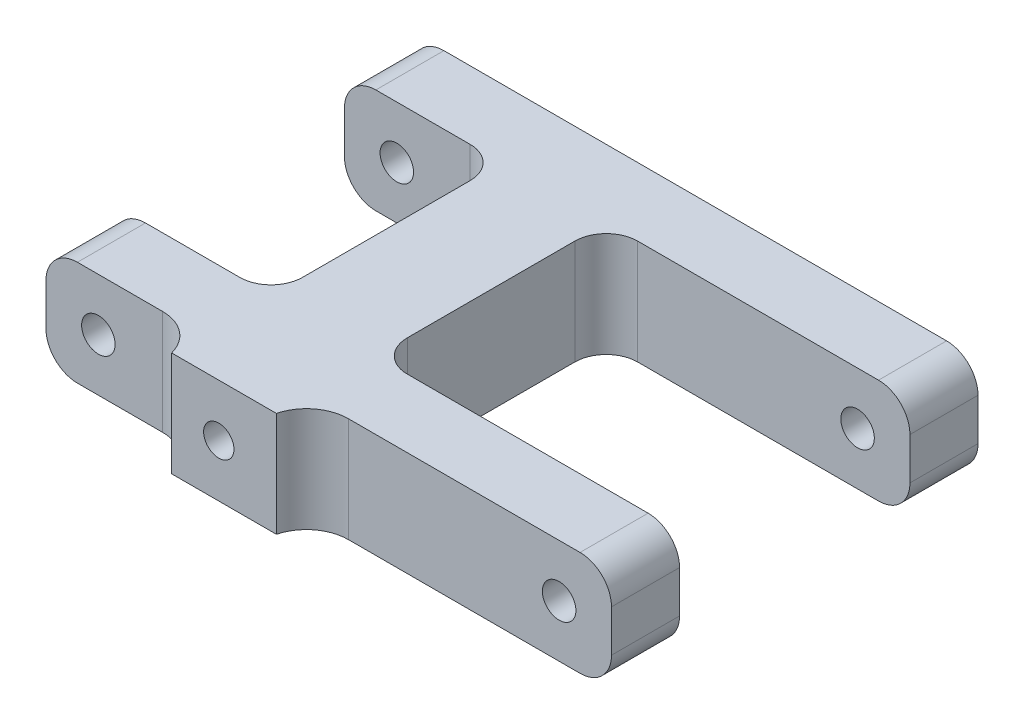
ISO-10303-21;
HEADER;
FILE_DESCRIPTION(('STEP AP214'),'2;1');
FILE_NAME('part.step','',(''),(''),'','','');
FILE_SCHEMA(('AUTOMOTIVE_DESIGN { 1 0 10303 214 1 1 1 1 }'));
ENDSEC;
DATA;
#1=APPLICATION_CONTEXT('core data for automotive mechanical design processes');
#2=APPLICATION_PROTOCOL_DEFINITION('international standard','automotive_design',2000,#1);
#3=PRODUCT_CONTEXT('',#1,'mechanical');
#4=PRODUCT('Part','Part','',(#3));
#5=PRODUCT_RELATED_PRODUCT_CATEGORY('part','',(#4));
#6=PRODUCT_DEFINITION_FORMATION('','',#4);
#7=PRODUCT_DEFINITION_CONTEXT('part definition',#1,'design');
#8=PRODUCT_DEFINITION('design','',#6,#7);
#9=PRODUCT_DEFINITION_SHAPE('','',#8);
#10=(LENGTH_UNIT() NAMED_UNIT(*) SI_UNIT(.MILLI.,.METRE.));
#11=(NAMED_UNIT(*) PLANE_ANGLE_UNIT() SI_UNIT($,.RADIAN.));
#12=(NAMED_UNIT(*) SI_UNIT($,.STERADIAN.) SOLID_ANGLE_UNIT());
#13=UNCERTAINTY_MEASURE_WITH_UNIT(LENGTH_MEASURE(1.E-05),#10,'distance_accuracy_value','');
#14=(GEOMETRIC_REPRESENTATION_CONTEXT(3) GLOBAL_UNCERTAINTY_ASSIGNED_CONTEXT((#13)) GLOBAL_UNIT_ASSIGNED_CONTEXT((#10,
#11,#12)) REPRESENTATION_CONTEXT('',''));
#15=CARTESIAN_POINT('',(0.,0.,0.));
#16=DIRECTION('',(0.,0.,1.));
#17=DIRECTION('',(1.,0.,0.));
#18=AXIS2_PLACEMENT_3D('',#15,#16,#17);
#19=CARTESIAN_POINT('',(0.,10.,35.));
#20=DIRECTION('',(0.,0.,-1.));
#21=DIRECTION('',(-1.,0.,0.));
#22=AXIS2_PLACEMENT_3D('',#19,#20,#21);
#23=PLANE('',#22);
#24=CARTESIAN_POINT('',(5.,5.,35.));
#25=DIRECTION('',(0.,0.,1.));
#26=DIRECTION('',(1.,0.,0.));
#27=AXIS2_PLACEMENT_3D('',#24,#25,#26);
#28=CIRCLE('',#27,1.6);
#29=CARTESIAN_POINT('',(6.6,5.,35.));
#30=VERTEX_POINT('',#29);
#31=EDGE_CURVE('E254',#30,#30,#28,.T.);
#32=ORIENTED_EDGE('',*,*,#31,.F.);
#33=EDGE_LOOP('',(#32));
#34=FACE_BOUND('',#33,.T.);
#35=DIRECTION('',(1.,0.,0.));
#36=VECTOR('',#35,1.);
#37=CARTESIAN_POINT('',(0.,0.,35.));
#38=LINE('',#37,#36);
#39=CARTESIAN_POINT('',(3.,0.,35.));
#40=VERTEX_POINT('',#39);
#41=CARTESIAN_POINT('',(11.1270166537926,0.,35.));
#42=VERTEX_POINT('',#41);
#43=EDGE_CURVE('E312',#40,#42,#38,.T.);
#44=ORIENTED_EDGE('',*,*,#43,.T.);
#45=DIRECTION('',(0.,-1.,0.));
#46=VECTOR('',#45,1.);
#47=CARTESIAN_POINT('',(11.1270166537926,10.,35.));
#48=LINE('',#47,#46);
#49=CARTESIAN_POINT('',(11.1270166537926,10.,35.));
#50=VERTEX_POINT('',#49);
#51=EDGE_CURVE('E54',#42,#50,#48,.F.);
#52=ORIENTED_EDGE('',*,*,#51,.T.);
#53=DIRECTION('',(1.,0.,0.));
#54=VECTOR('',#53,1.);
#55=CARTESIAN_POINT('',(0.,10.,35.));
#56=LINE('',#55,#54);
#57=CARTESIAN_POINT('',(3.,10.,35.));
#58=VERTEX_POINT('',#57);
#59=EDGE_CURVE('E305',#58,#50,#56,.T.);
#60=ORIENTED_EDGE('',*,*,#59,.F.);
#61=CARTESIAN_POINT('',(3.,7.,35.));
#62=DIRECTION('',(0.,0.,-1.));
#63=DIRECTION('',(-1.,0.,0.));
#64=AXIS2_PLACEMENT_3D('',#61,#62,#63);
#65=CIRCLE('',#64,3.);
#66=CARTESIAN_POINT('',(0.,7.,35.));
#67=VERTEX_POINT('',#66);
#68=EDGE_CURVE('E342',#58,#67,#65,.F.);
#69=ORIENTED_EDGE('',*,*,#68,.T.);
#70=DIRECTION('',(0.,-1.,0.));
#71=VECTOR('',#70,1.);
#72=CARTESIAN_POINT('',(0.,10.,35.));
#73=LINE('',#72,#71);
#74=CARTESIAN_POINT('',(0.,3.,35.));
#75=VERTEX_POINT('',#74);
#76=EDGE_CURVE('E325',#67,#75,#73,.T.);
#77=ORIENTED_EDGE('',*,*,#76,.T.);
#78=CARTESIAN_POINT('',(3.,3.,35.));
#79=DIRECTION('',(0.,0.,-1.));
#80=DIRECTION('',(-1.,0.,0.));
#81=AXIS2_PLACEMENT_3D('',#78,#79,#80);
#82=CIRCLE('',#81,3.);
#83=EDGE_CURVE('E344',#75,#40,#82,.F.);
#84=ORIENTED_EDGE('',*,*,#83,.T.);
#85=EDGE_LOOP('',(#44,#52,#60,#69,#77,#84));
#86=FACE_BOUND('',#85,.T.);
#87=ADVANCED_FACE('F33',(#34,#86),#23,.F.);
#88=CARTESIAN_POINT('',(49.,5.,35.));
#89=DIRECTION('',(0.,0.,1.));
#90=DIRECTION('',(1.,0.,0.));
#91=AXIS2_PLACEMENT_3D('',#88,#89,#90);
#92=CIRCLE('',#91,1.59999999999999);
#93=CARTESIAN_POINT('',(50.6,5.,35.));
#94=VERTEX_POINT('',#93);
#95=EDGE_CURVE('E244',#94,#94,#92,.T.);
#96=ORIENTED_EDGE('',*,*,#95,.F.);
#97=EDGE_LOOP('',(#96));
#98=FACE_BOUND('',#97,.T.);
#99=CARTESIAN_POINT('',(28.8729833462074,10.,35.));
#100=VERTEX_POINT('',#99);
#101=CARTESIAN_POINT('',(51.,10.,35.));
#102=VERTEX_POINT('',#101);
#103=EDGE_CURVE('E308',#100,#102,#56,.T.);
#104=ORIENTED_EDGE('',*,*,#103,.F.);
#105=DIRECTION('',(0.,1.,0.));
#106=VECTOR('',#105,1.);
#107=CARTESIAN_POINT('',(28.8729833462074,9.99999999999999,35.));
#108=LINE('',#107,#106);
#109=CARTESIAN_POINT('',(28.8729833462074,0.,35.));
#110=VERTEX_POINT('',#109);
#111=EDGE_CURVE('E447',#100,#110,#108,.F.);
#112=ORIENTED_EDGE('',*,*,#111,.T.);
#113=CARTESIAN_POINT('',(51.,0.,35.));
#114=VERTEX_POINT('',#113);
#115=EDGE_CURVE('E299',#110,#114,#38,.T.);
#116=ORIENTED_EDGE('',*,*,#115,.T.);
#117=CARTESIAN_POINT('',(51.,3.,35.));
#118=DIRECTION('',(0.,0.,-1.));
#119=DIRECTION('',(-1.,0.,0.));
#120=AXIS2_PLACEMENT_3D('',#117,#118,#119);
#121=CIRCLE('',#120,3.);
#122=CARTESIAN_POINT('',(54.,3.,35.));
#123=VERTEX_POINT('',#122);
#124=EDGE_CURVE('E340',#114,#123,#121,.F.);
#125=ORIENTED_EDGE('',*,*,#124,.T.);
#126=DIRECTION('',(0.,-1.,0.));
#127=VECTOR('',#126,1.);
#128=CARTESIAN_POINT('',(54.,10.,35.));
#129=LINE('',#128,#127);
#130=CARTESIAN_POINT('',(54.,7.,35.));
#131=VERTEX_POINT('',#130);
#132=EDGE_CURVE('E322',#131,#123,#129,.T.);
#133=ORIENTED_EDGE('',*,*,#132,.F.);
#134=CARTESIAN_POINT('',(51.,7.,35.));
#135=DIRECTION('',(0.,0.,-1.));
#136=DIRECTION('',(-1.,0.,0.));
#137=AXIS2_PLACEMENT_3D('',#134,#135,#136);
#138=CIRCLE('',#137,3.);
#139=EDGE_CURVE('E337',#131,#102,#138,.F.);
#140=ORIENTED_EDGE('',*,*,#139,.T.);
#141=EDGE_LOOP('',(#104,#112,#116,#125,#133,#140));
#142=FACE_BOUND('',#141,.T.);
#143=ADVANCED_FACE('F460',(#98,#142),#23,.F.);
#144=CARTESIAN_POINT('',(0.,10.,0.));
#145=DIRECTION('',(1.,0.,0.));
#146=DIRECTION('',(0.,0.,-1.));
#147=AXIS2_PLACEMENT_3D('',#144,#145,#146);
#148=PLANE('',#147);
#149=DIRECTION('',(0.,-1.,0.));
#150=VECTOR('',#149,1.);
#151=CARTESIAN_POINT('',(0.,10.,0.));
#152=LINE('',#151,#150);
#153=CARTESIAN_POINT('',(0.,7.,0.));
#154=VERTEX_POINT('',#153);
#155=CARTESIAN_POINT('',(0.,3.,0.));
#156=VERTEX_POINT('',#155);
#157=EDGE_CURVE('E311',#154,#156,#152,.T.);
#158=ORIENTED_EDGE('',*,*,#157,.T.);
#159=DIRECTION('',(0.,0.,1.));
#160=VECTOR('',#159,1.);
#161=CARTESIAN_POINT('',(0.,3.,0.));
#162=LINE('',#161,#160);
#163=CARTESIAN_POINT('',(0.,3.,6.5));
#164=VERTEX_POINT('',#163);
#165=EDGE_CURVE('E376',#156,#164,#162,.T.);
#166=ORIENTED_EDGE('',*,*,#165,.T.);
#167=DIRECTION('',(0.,-1.,0.));
#168=VECTOR('',#167,1.);
#169=CARTESIAN_POINT('',(0.,10.,6.5));
#170=LINE('',#169,#168);
#171=CARTESIAN_POINT('',(0.,7.,6.5));
#172=VERTEX_POINT('',#171);
#173=EDGE_CURVE('E264',#172,#164,#170,.T.);
#174=ORIENTED_EDGE('',*,*,#173,.F.);
#175=DIRECTION('',(0.,0.,1.));
#176=VECTOR('',#175,1.);
#177=CARTESIAN_POINT('',(0.,7.,0.));
#178=LINE('',#177,#176);
#179=EDGE_CURVE('E374',#172,#154,#178,.F.);
#180=ORIENTED_EDGE('',*,*,#179,.T.);
#181=EDGE_LOOP('',(#158,#166,#174,#180));
#182=FACE_BOUND('',#181,.T.);
#183=ADVANCED_FACE('F481',(#182),#148,.F.);
#184=CARTESIAN_POINT('',(54.,10.,0.));
#185=DIRECTION('',(-1.,0.,0.));
#186=DIRECTION('',(0.,0.,1.));
#187=AXIS2_PLACEMENT_3D('',#184,#185,#186);
#188=PLANE('',#187);
#189=ORIENTED_EDGE('',*,*,#132,.T.);
#190=DIRECTION('',(0.,0.,-1.));
#191=VECTOR('',#190,1.);
#192=CARTESIAN_POINT('',(54.,3.,0.));
#193=LINE('',#192,#191);
#194=CARTESIAN_POINT('',(54.,3.,28.5));
#195=VERTEX_POINT('',#194);
#196=EDGE_CURVE('E404',#123,#195,#193,.T.);
#197=ORIENTED_EDGE('',*,*,#196,.T.);
#198=DIRECTION('',(0.,-1.,0.));
#199=VECTOR('',#198,1.);
#200=CARTESIAN_POINT('',(54.,10.,28.5));
#201=LINE('',#200,#199);
#202=CARTESIAN_POINT('',(54.,7.,28.5));
#203=VERTEX_POINT('',#202);
#204=EDGE_CURVE('E279',#203,#195,#201,.T.);
#205=ORIENTED_EDGE('',*,*,#204,.F.);
#206=DIRECTION('',(0.,0.,-1.));
#207=VECTOR('',#206,1.);
#208=CARTESIAN_POINT('',(54.,7.,35.));
#209=LINE('',#208,#207);
#210=EDGE_CURVE('E402',#203,#131,#209,.F.);
#211=ORIENTED_EDGE('',*,*,#210,.T.);
#212=EDGE_LOOP('',(#189,#197,#205,#211));
#213=FACE_BOUND('',#212,.T.);
#214=ADVANCED_FACE('F491',(#213),#188,.F.);
#215=DIRECTION('',(0.,1.,0.));
#216=VECTOR('',#215,1.);
#217=CARTESIAN_POINT('',(0.,10.,28.5));
#218=LINE('',#217,#216);
#219=CARTESIAN_POINT('',(0.,3.,28.5));
#220=VERTEX_POINT('',#219);
#221=CARTESIAN_POINT('',(0.,7.,28.5));
#222=VERTEX_POINT('',#221);
#223=EDGE_CURVE('E269',#220,#222,#218,.T.);
#224=ORIENTED_EDGE('',*,*,#223,.F.);
#225=DIRECTION('',(0.,0.,1.));
#226=VECTOR('',#225,1.);
#227=CARTESIAN_POINT('',(0.,3.,0.));
#228=LINE('',#227,#226);
#229=EDGE_CURVE('E334',#220,#75,#228,.T.);
#230=ORIENTED_EDGE('',*,*,#229,.T.);
#231=ORIENTED_EDGE('',*,*,#76,.F.);
#232=DIRECTION('',(0.,0.,1.));
#233=VECTOR('',#232,1.);
#234=CARTESIAN_POINT('',(0.,7.,28.5));
#235=LINE('',#234,#233);
#236=EDGE_CURVE('E328',#67,#222,#235,.F.);
#237=ORIENTED_EDGE('',*,*,#236,.T.);
#238=EDGE_LOOP('',(#224,#230,#231,#237));
#239=FACE_BOUND('',#238,.T.);
#240=ADVANCED_FACE('F488',(#239),#148,.F.);
#241=DIRECTION('',(0.,-1.,0.));
#242=VECTOR('',#241,1.);
#243=CARTESIAN_POINT('',(54.,10.,0.));
#244=LINE('',#243,#242);
#245=CARTESIAN_POINT('',(54.,7.,0.));
#246=VERTEX_POINT('',#245);
#247=CARTESIAN_POINT('',(54.,3.,0.));
#248=VERTEX_POINT('',#247);
#249=EDGE_CURVE('E319',#246,#248,#244,.T.);
#250=ORIENTED_EDGE('',*,*,#249,.F.);
#251=DIRECTION('',(0.,0.,-1.));
#252=VECTOR('',#251,1.);
#253=CARTESIAN_POINT('',(54.,7.,6.5));
#254=LINE('',#253,#252);
#255=CARTESIAN_POINT('',(54.,7.,6.5));
#256=VERTEX_POINT('',#255);
#257=EDGE_CURVE('E395',#246,#256,#254,.F.);
#258=ORIENTED_EDGE('',*,*,#257,.T.);
#259=DIRECTION('',(0.,1.,0.));
#260=VECTOR('',#259,1.);
#261=CARTESIAN_POINT('',(54.,10.,6.5));
#262=LINE('',#261,#260);
#263=CARTESIAN_POINT('',(54.,3.,6.5));
#264=VERTEX_POINT('',#263);
#265=EDGE_CURVE('E289',#264,#256,#262,.T.);
#266=ORIENTED_EDGE('',*,*,#265,.F.);
#267=DIRECTION('',(0.,0.,-1.));
#268=VECTOR('',#267,1.);
#269=CARTESIAN_POINT('',(54.,3.,0.));
#270=LINE('',#269,#268);
#271=EDGE_CURVE('E392',#264,#248,#270,.T.);
#272=ORIENTED_EDGE('',*,*,#271,.T.);
#273=EDGE_LOOP('',(#250,#258,#266,#272));
#274=FACE_BOUND('',#273,.T.);
#275=ADVANCED_FACE('F486',(#274),#188,.F.);
#276=CARTESIAN_POINT('',(0.,10.,0.));
#277=DIRECTION('',(0.,0.,1.));
#278=DIRECTION('',(1.,0.,0.));
#279=AXIS2_PLACEMENT_3D('',#276,#277,#278);
#280=PLANE('',#279);
#281=CARTESIAN_POINT('',(49.,5.,0.));
#282=DIRECTION('',(0.,0.,1.));
#283=DIRECTION('',(1.,0.,0.));
#284=AXIS2_PLACEMENT_3D('',#281,#282,#283);
#285=CIRCLE('',#284,1.59999999999999);
#286=CARTESIAN_POINT('',(50.6,5.,0.));
#287=VERTEX_POINT('',#286);
#288=EDGE_CURVE('E245',#287,#287,#285,.T.);
#289=ORIENTED_EDGE('',*,*,#288,.T.);
#290=EDGE_LOOP('',(#289));
#291=FACE_BOUND('',#290,.T.);
#292=CARTESIAN_POINT('',(5.,5.,0.));
#293=DIRECTION('',(0.,0.,1.));
#294=DIRECTION('',(1.,0.,0.));
#295=AXIS2_PLACEMENT_3D('',#292,#293,#294);
#296=CIRCLE('',#295,1.6);
#297=CARTESIAN_POINT('',(6.6,5.,0.));
#298=VERTEX_POINT('',#297);
#299=EDGE_CURVE('E255',#298,#298,#296,.T.);
#300=ORIENTED_EDGE('',*,*,#299,.T.);
#301=EDGE_LOOP('',(#300));
#302=FACE_BOUND('',#301,.T.);
#303=DIRECTION('',(-1.,0.,0.));
#304=VECTOR('',#303,1.);
#305=CARTESIAN_POINT('',(0.,0.,0.));
#306=LINE('',#305,#304);
#307=CARTESIAN_POINT('',(51.,0.,0.));
#308=VERTEX_POINT('',#307);
#309=CARTESIAN_POINT('',(3.,0.,0.));
#310=VERTEX_POINT('',#309);
#311=EDGE_CURVE('E314',#308,#310,#306,.T.);
#312=ORIENTED_EDGE('',*,*,#311,.T.);
#313=CARTESIAN_POINT('',(3.,3.,0.));
#314=DIRECTION('',(0.,0.,1.));
#315=DIRECTION('',(1.,0.,0.));
#316=AXIS2_PLACEMENT_3D('',#313,#314,#315);
#317=CIRCLE('',#316,3.);
#318=EDGE_CURVE('E390',#310,#156,#317,.F.);
#319=ORIENTED_EDGE('',*,*,#318,.T.);
#320=ORIENTED_EDGE('',*,*,#157,.F.);
#321=CARTESIAN_POINT('',(3.,7.,0.));
#322=DIRECTION('',(0.,0.,1.));
#323=DIRECTION('',(1.,0.,0.));
#324=AXIS2_PLACEMENT_3D('',#321,#322,#323);
#325=CIRCLE('',#324,3.);
#326=CARTESIAN_POINT('',(3.,10.,0.));
#327=VERTEX_POINT('',#326);
#328=EDGE_CURVE('E388',#154,#327,#325,.F.);
#329=ORIENTED_EDGE('',*,*,#328,.T.);
#330=DIRECTION('',(-1.,0.,0.));
#331=VECTOR('',#330,1.);
#332=CARTESIAN_POINT('',(0.,10.,0.));
#333=LINE('',#332,#331);
#334=CARTESIAN_POINT('',(51.,10.,0.));
#335=VERTEX_POINT('',#334);
#336=EDGE_CURVE('E307',#335,#327,#333,.T.);
#337=ORIENTED_EDGE('',*,*,#336,.F.);
#338=CARTESIAN_POINT('',(51.,7.,0.));
#339=DIRECTION('',(0.,0.,1.));
#340=DIRECTION('',(1.,0.,0.));
#341=AXIS2_PLACEMENT_3D('',#338,#339,#340);
#342=CIRCLE('',#341,3.);
#343=EDGE_CURVE('E386',#335,#246,#342,.F.);
#344=ORIENTED_EDGE('',*,*,#343,.T.);
#345=ORIENTED_EDGE('',*,*,#249,.T.);
#346=CARTESIAN_POINT('',(51.,3.,0.));
#347=DIRECTION('',(0.,0.,1.));
#348=DIRECTION('',(1.,0.,0.));
#349=AXIS2_PLACEMENT_3D('',#346,#347,#348);
#350=CIRCLE('',#349,3.);
#351=EDGE_CURVE('E384',#248,#308,#350,.F.);
#352=ORIENTED_EDGE('',*,*,#351,.T.);
#353=EDGE_LOOP('',(#312,#319,#320,#329,#337,#344,#345,#352));
#354=FACE_BOUND('',#353,.T.);
#355=ADVANCED_FACE('F577',(#291,#302,#354),#280,.F.);
#356=CARTESIAN_POINT('',(0.,10.,0.));
#357=DIRECTION('',(0.,1.,0.));
#358=DIRECTION('',(0.,0.,1.));
#359=AXIS2_PLACEMENT_3D('',#356,#357,#358);
#360=PLANE('',#359);
#361=DIRECTION('',(0.,0.,-1.));
#362=VECTOR('',#361,1.);
#363=CARTESIAN_POINT('',(15.,10.,6.5));
#364=LINE('',#363,#362);
#365=CARTESIAN_POINT('',(15.,10.,25.5));
#366=VERTEX_POINT('',#365);
#367=CARTESIAN_POINT('',(15.,10.,9.5));
#368=VERTEX_POINT('',#367);
#369=EDGE_CURVE('E268',#366,#368,#364,.T.);
#370=ORIENTED_EDGE('',*,*,#369,.F.);
#371=CARTESIAN_POINT('',(12.,10.,25.5));
#372=DIRECTION('',(0.,1.,0.));
#373=DIRECTION('',(0.,0.,1.));
#374=AXIS2_PLACEMENT_3D('',#371,#372,#373);
#375=CIRCLE('',#374,3.);
#376=CARTESIAN_POINT('',(12.,10.,28.5));
#377=VERTEX_POINT('',#376);
#378=EDGE_CURVE('E440',#366,#377,#375,.F.);
#379=ORIENTED_EDGE('',*,*,#378,.T.);
#380=DIRECTION('',(-1.,0.,0.));
#381=VECTOR('',#380,1.);
#382=CARTESIAN_POINT('',(15.,10.,28.5));
#383=LINE('',#382,#381);
#384=CARTESIAN_POINT('',(3.,10.,28.5));
#385=VERTEX_POINT('',#384);
#386=EDGE_CURVE('E280',#377,#385,#383,.T.);
#387=ORIENTED_EDGE('',*,*,#386,.T.);
#388=DIRECTION('',(0.,0.,1.));
#389=VECTOR('',#388,1.);
#390=CARTESIAN_POINT('',(3.,10.,35.));
#391=LINE('',#390,#389);
#392=EDGE_CURVE('E371',#385,#58,#391,.T.);
#393=ORIENTED_EDGE('',*,*,#392,.T.);
#394=ORIENTED_EDGE('',*,*,#59,.T.);
#395=CARTESIAN_POINT('',(11.1270166537926,10.,39.));
#396=DIRECTION('',(0.,1.,0.));
#397=DIRECTION('',(0.,0.,1.));
#398=AXIS2_PLACEMENT_3D('',#395,#396,#397);
#399=CIRCLE('',#398,4.);
#400=CARTESIAN_POINT('',(15.,10.,38.));
#401=VERTEX_POINT('',#400);
#402=EDGE_CURVE('E11',#50,#401,#399,.F.);
#403=ORIENTED_EDGE('',*,*,#402,.T.);
#404=DIRECTION('',(-1.,0.,0.));
#405=VECTOR('',#404,1.);
#406=CARTESIAN_POINT('',(15.,10.,38.));
#407=LINE('',#406,#405);
#408=CARTESIAN_POINT('',(25.,10.,38.));
#409=VERTEX_POINT('',#408);
#410=EDGE_CURVE('E234',#409,#401,#407,.T.);
#411=ORIENTED_EDGE('',*,*,#410,.F.);
#412=CARTESIAN_POINT('',(28.8729833462074,10.,39.));
#413=DIRECTION('',(0.,1.,0.));
#414=DIRECTION('',(0.,0.,1.));
#415=AXIS2_PLACEMENT_3D('',#412,#413,#414);
#416=CIRCLE('',#415,4.);
#417=EDGE_CURVE('E451',#409,#100,#416,.F.);
#418=ORIENTED_EDGE('',*,*,#417,.T.);
#419=ORIENTED_EDGE('',*,*,#103,.T.);
#420=DIRECTION('',(0.,0.,-1.));
#421=VECTOR('',#420,1.);
#422=CARTESIAN_POINT('',(51.,10.,28.5));
#423=LINE('',#422,#421);
#424=CARTESIAN_POINT('',(51.,10.,28.5));
#425=VERTEX_POINT('',#424);
#426=EDGE_CURVE('E362',#102,#425,#423,.T.);
#427=ORIENTED_EDGE('',*,*,#426,.T.);
#428=DIRECTION('',(1.,0.,0.));
#429=VECTOR('',#428,1.);
#430=CARTESIAN_POINT('',(25.,10.,28.5));
#431=LINE('',#430,#429);
#432=CARTESIAN_POINT('',(28.,10.,28.5));
#433=VERTEX_POINT('',#432);
#434=EDGE_CURVE('E297',#433,#425,#431,.T.);
#435=ORIENTED_EDGE('',*,*,#434,.F.);
#436=CARTESIAN_POINT('',(28.,10.,25.5));
#437=DIRECTION('',(0.,1.,0.));
#438=DIRECTION('',(0.,0.,1.));
#439=AXIS2_PLACEMENT_3D('',#436,#437,#438);
#440=CIRCLE('',#439,3.);
#441=CARTESIAN_POINT('',(25.,10.,25.5));
#442=VERTEX_POINT('',#441);
#443=EDGE_CURVE('E434',#433,#442,#440,.F.);
#444=ORIENTED_EDGE('',*,*,#443,.T.);
#445=DIRECTION('',(0.,0.,1.));
#446=VECTOR('',#445,1.);
#447=CARTESIAN_POINT('',(25.,10.,28.5));
#448=LINE('',#447,#446);
#449=CARTESIAN_POINT('',(25.,10.,9.5));
#450=VERTEX_POINT('',#449);
#451=EDGE_CURVE('E288',#450,#442,#448,.T.);
#452=ORIENTED_EDGE('',*,*,#451,.F.);
#453=CARTESIAN_POINT('',(28.,10.,9.5));
#454=DIRECTION('',(0.,1.,0.));
#455=DIRECTION('',(0.,0.,1.));
#456=AXIS2_PLACEMENT_3D('',#453,#454,#455);
#457=CIRCLE('',#456,3.);
#458=CARTESIAN_POINT('',(28.,10.,6.5));
#459=VERTEX_POINT('',#458);
#460=EDGE_CURVE('E436',#450,#459,#457,.F.);
#461=ORIENTED_EDGE('',*,*,#460,.T.);
#462=DIRECTION('',(1.,0.,0.));
#463=VECTOR('',#462,1.);
#464=CARTESIAN_POINT('',(25.,10.,6.5));
#465=LINE('',#464,#463);
#466=CARTESIAN_POINT('',(51.,10.,6.5));
#467=VERTEX_POINT('',#466);
#468=EDGE_CURVE('E300',#459,#467,#465,.T.);
#469=ORIENTED_EDGE('',*,*,#468,.T.);
#470=DIRECTION('',(0.,0.,-1.));
#471=VECTOR('',#470,1.);
#472=CARTESIAN_POINT('',(51.,10.,0.));
#473=LINE('',#472,#471);
#474=EDGE_CURVE('E365',#467,#335,#473,.T.);
#475=ORIENTED_EDGE('',*,*,#474,.T.);
#476=ORIENTED_EDGE('',*,*,#336,.T.);
#477=DIRECTION('',(0.,0.,1.));
#478=VECTOR('',#477,1.);
#479=CARTESIAN_POINT('',(3.,10.,6.5));
#480=LINE('',#479,#478);
#481=CARTESIAN_POINT('',(3.,10.,6.5));
#482=VERTEX_POINT('',#481);
#483=EDGE_CURVE('E368',#327,#482,#480,.T.);
#484=ORIENTED_EDGE('',*,*,#483,.T.);
#485=DIRECTION('',(-1.,0.,0.));
#486=VECTOR('',#485,1.);
#487=CARTESIAN_POINT('',(15.,10.,6.5));
#488=LINE('',#487,#486);
#489=CARTESIAN_POINT('',(12.,10.,6.5));
#490=VERTEX_POINT('',#489);
#491=EDGE_CURVE('E277',#490,#482,#488,.T.);
#492=ORIENTED_EDGE('',*,*,#491,.F.);
#493=CARTESIAN_POINT('',(12.,10.,9.5));
#494=DIRECTION('',(0.,1.,0.));
#495=DIRECTION('',(0.,0.,1.));
#496=AXIS2_PLACEMENT_3D('',#493,#494,#495);
#497=CIRCLE('',#496,3.);
#498=EDGE_CURVE('E446',#490,#368,#497,.F.);
#499=ORIENTED_EDGE('',*,*,#498,.T.);
#500=EDGE_LOOP('',(#370,#379,#387,#393,#394,#403,#411,#418,#419,#427,#435,#444,#452,#461,#469,
#475,#476,#484,#492,#499));
#501=FACE_BOUND('',#500,.T.);
#502=ADVANCED_FACE('F456',(#501),#360,.T.);
#503=CARTESIAN_POINT('',(0.,0.,0.));
#504=DIRECTION('',(0.,1.,0.));
#505=DIRECTION('',(0.,0.,1.));
#506=AXIS2_PLACEMENT_3D('',#503,#504,#505);
#507=PLANE('',#506);
#508=ORIENTED_EDGE('',*,*,#43,.F.);
#509=DIRECTION('',(0.,0.,1.));
#510=VECTOR('',#509,1.);
#511=CARTESIAN_POINT('',(3.,0.,0.));
#512=LINE('',#511,#510);
#513=CARTESIAN_POINT('',(3.,0.,28.5));
#514=VERTEX_POINT('',#513);
#515=EDGE_CURVE('E354',#40,#514,#512,.F.);
#516=ORIENTED_EDGE('',*,*,#515,.T.);
#517=DIRECTION('',(-1.,0.,0.));
#518=VECTOR('',#517,1.);
#519=CARTESIAN_POINT('',(15.,0.,28.5));
#520=LINE('',#519,#518);
#521=CARTESIAN_POINT('',(12.,0.,28.5));
#522=VERTEX_POINT('',#521);
#523=EDGE_CURVE('E282',#522,#514,#520,.T.);
#524=ORIENTED_EDGE('',*,*,#523,.F.);
#525=CARTESIAN_POINT('',(12.,0.,25.5));
#526=DIRECTION('',(0.,1.,0.));
#527=DIRECTION('',(0.,0.,1.));
#528=AXIS2_PLACEMENT_3D('',#525,#526,#527);
#529=CIRCLE('',#528,3.);
#530=CARTESIAN_POINT('',(15.,0.,25.5));
#531=VERTEX_POINT('',#530);
#532=EDGE_CURVE('E442',#522,#531,#529,.T.);
#533=ORIENTED_EDGE('',*,*,#532,.T.);
#534=DIRECTION('',(0.,0.,1.));
#535=VECTOR('',#534,1.);
#536=CARTESIAN_POINT('',(15.,0.,6.5));
#537=LINE('',#536,#535);
#538=CARTESIAN_POINT('',(15.,0.,9.5));
#539=VERTEX_POINT('',#538);
#540=EDGE_CURVE('E265',#539,#531,#537,.T.);
#541=ORIENTED_EDGE('',*,*,#540,.F.);
#542=CARTESIAN_POINT('',(12.,0.,9.5));
#543=DIRECTION('',(0.,1.,0.));
#544=DIRECTION('',(0.,0.,1.));
#545=AXIS2_PLACEMENT_3D('',#542,#543,#544);
#546=CIRCLE('',#545,3.);
#547=CARTESIAN_POINT('',(12.,0.,6.5));
#548=VERTEX_POINT('',#547);
#549=EDGE_CURVE('E444',#539,#548,#546,.T.);
#550=ORIENTED_EDGE('',*,*,#549,.T.);
#551=DIRECTION('',(-1.,0.,0.));
#552=VECTOR('',#551,1.);
#553=CARTESIAN_POINT('',(15.,0.,6.5));
#554=LINE('',#553,#552);
#555=CARTESIAN_POINT('',(3.,0.,6.5));
#556=VERTEX_POINT('',#555);
#557=EDGE_CURVE('E272',#548,#556,#554,.T.);
#558=ORIENTED_EDGE('',*,*,#557,.T.);
#559=DIRECTION('',(0.,0.,1.));
#560=VECTOR('',#559,1.);
#561=CARTESIAN_POINT('',(3.,0.,0.));
#562=LINE('',#561,#560);
#563=EDGE_CURVE('E352',#556,#310,#562,.F.);
#564=ORIENTED_EDGE('',*,*,#563,.T.);
#565=ORIENTED_EDGE('',*,*,#311,.F.);
#566=DIRECTION('',(0.,0.,-1.));
#567=VECTOR('',#566,1.);
#568=CARTESIAN_POINT('',(51.,0.,0.));
#569=LINE('',#568,#567);
#570=CARTESIAN_POINT('',(51.,0.,6.5));
#571=VERTEX_POINT('',#570);
#572=EDGE_CURVE('E349',#308,#571,#569,.F.);
#573=ORIENTED_EDGE('',*,*,#572,.T.);
#574=DIRECTION('',(1.,0.,0.));
#575=VECTOR('',#574,1.);
#576=CARTESIAN_POINT('',(25.,0.,6.5));
#577=LINE('',#576,#575);
#578=CARTESIAN_POINT('',(28.,0.,6.5));
#579=VERTEX_POINT('',#578);
#580=EDGE_CURVE('E302',#579,#571,#577,.T.);
#581=ORIENTED_EDGE('',*,*,#580,.F.);
#582=CARTESIAN_POINT('',(28.,0.,9.5));
#583=DIRECTION('',(0.,1.,0.));
#584=DIRECTION('',(0.,0.,1.));
#585=AXIS2_PLACEMENT_3D('',#582,#583,#584);
#586=CIRCLE('',#585,3.);
#587=CARTESIAN_POINT('',(25.,0.,9.5));
#588=VERTEX_POINT('',#587);
#589=EDGE_CURVE('E438',#579,#588,#586,.T.);
#590=ORIENTED_EDGE('',*,*,#589,.T.);
#591=DIRECTION('',(0.,0.,-1.));
#592=VECTOR('',#591,1.);
#593=CARTESIAN_POINT('',(25.,0.,28.5));
#594=LINE('',#593,#592);
#595=CARTESIAN_POINT('',(25.,0.,25.5));
#596=VERTEX_POINT('',#595);
#597=EDGE_CURVE('E285',#596,#588,#594,.T.);
#598=ORIENTED_EDGE('',*,*,#597,.F.);
#599=CARTESIAN_POINT('',(28.,0.,25.5));
#600=DIRECTION('',(0.,1.,0.));
#601=DIRECTION('',(0.,0.,1.));
#602=AXIS2_PLACEMENT_3D('',#599,#600,#601);
#603=CIRCLE('',#602,3.);
#604=CARTESIAN_POINT('',(28.,0.,28.5));
#605=VERTEX_POINT('',#604);
#606=EDGE_CURVE('E432',#596,#605,#603,.T.);
#607=ORIENTED_EDGE('',*,*,#606,.T.);
#608=DIRECTION('',(1.,0.,0.));
#609=VECTOR('',#608,1.);
#610=CARTESIAN_POINT('',(25.,0.,28.5));
#611=LINE('',#610,#609);
#612=CARTESIAN_POINT('',(51.,0.,28.5));
#613=VERTEX_POINT('',#612);
#614=EDGE_CURVE('E292',#605,#613,#611,.T.);
#615=ORIENTED_EDGE('',*,*,#614,.T.);
#616=DIRECTION('',(0.,0.,-1.));
#617=VECTOR('',#616,1.);
#618=CARTESIAN_POINT('',(51.,0.,0.));
#619=LINE('',#618,#617);
#620=EDGE_CURVE('E346',#613,#114,#619,.F.);
#621=ORIENTED_EDGE('',*,*,#620,.T.);
#622=ORIENTED_EDGE('',*,*,#115,.F.);
#623=CARTESIAN_POINT('',(28.8729833462074,0.,39.));
#624=DIRECTION('',(0.,1.,0.));
#625=DIRECTION('',(0.,0.,1.));
#626=AXIS2_PLACEMENT_3D('',#623,#624,#625);
#627=CIRCLE('',#626,4.);
#628=CARTESIAN_POINT('',(25.,0.,38.));
#629=VERTEX_POINT('',#628);
#630=EDGE_CURVE('E220',#110,#629,#627,.T.);
#631=ORIENTED_EDGE('',*,*,#630,.T.);
#632=DIRECTION('',(1.,0.,0.));
#633=VECTOR('',#632,1.);
#634=CARTESIAN_POINT('',(15.,0.,38.));
#635=LINE('',#634,#633);
#636=CARTESIAN_POINT('',(15.,0.,38.));
#637=VERTEX_POINT('',#636);
#638=EDGE_CURVE('E222',#637,#629,#635,.T.);
#639=ORIENTED_EDGE('',*,*,#638,.F.);
#640=CARTESIAN_POINT('',(11.1270166537926,0.,39.));
#641=DIRECTION('',(0.,1.,0.));
#642=DIRECTION('',(0.,0.,1.));
#643=AXIS2_PLACEMENT_3D('',#640,#641,#642);
#644=CIRCLE('',#643,4.);
#645=EDGE_CURVE('E41',#637,#42,#644,.T.);
#646=ORIENTED_EDGE('',*,*,#645,.T.);
#647=EDGE_LOOP('',(#508,#516,#524,#533,#541,#550,#558,#564,#565,#573,#581,#590,#598,#607,#615,
#621,#622,#631,#639,#646));
#648=FACE_BOUND('',#647,.T.);
#649=ADVANCED_FACE('F223',(#648),#507,.F.);
#650=CARTESIAN_POINT('',(25.,10.,28.5));
#651=DIRECTION('',(0.,0.,1.));
#652=DIRECTION('',(1.,0.,0.));
#653=AXIS2_PLACEMENT_3D('',#650,#651,#652);
#654=PLANE('',#653);
#655=CARTESIAN_POINT('',(49.,5.,28.5));
#656=DIRECTION('',(0.,0.,1.));
#657=DIRECTION('',(1.,0.,0.));
#658=AXIS2_PLACEMENT_3D('',#655,#656,#657);
#659=CIRCLE('',#658,1.59999999999999);
#660=CARTESIAN_POINT('',(50.6,5.,28.5));
#661=VERTEX_POINT('',#660);
#662=EDGE_CURVE('E251',#661,#661,#659,.T.);
#663=ORIENTED_EDGE('',*,*,#662,.T.);
#664=EDGE_LOOP('',(#663));
#665=FACE_BOUND('',#664,.T.);
#666=ORIENTED_EDGE('',*,*,#614,.F.);
#667=DIRECTION('',(0.,-1.,0.));
#668=VECTOR('',#667,1.);
#669=CARTESIAN_POINT('',(28.,10.,28.5));
#670=LINE('',#669,#668);
#671=EDGE_CURVE('E418',#605,#433,#670,.F.);
#672=ORIENTED_EDGE('',*,*,#671,.T.);
#673=ORIENTED_EDGE('',*,*,#434,.T.);
#674=CARTESIAN_POINT('',(51.,7.,28.5));
#675=DIRECTION('',(0.,0.,1.));
#676=DIRECTION('',(1.,0.,0.));
#677=AXIS2_PLACEMENT_3D('',#674,#675,#676);
#678=CIRCLE('',#677,3.);
#679=EDGE_CURVE('E407',#425,#203,#678,.F.);
#680=ORIENTED_EDGE('',*,*,#679,.T.);
#681=ORIENTED_EDGE('',*,*,#204,.T.);
#682=CARTESIAN_POINT('',(51.,3.,28.5));
#683=DIRECTION('',(0.,0.,1.));
#684=DIRECTION('',(1.,0.,0.));
#685=AXIS2_PLACEMENT_3D('',#682,#683,#684);
#686=CIRCLE('',#685,3.);
#687=EDGE_CURVE('E409',#195,#613,#686,.F.);
#688=ORIENTED_EDGE('',*,*,#687,.T.);
#689=EDGE_LOOP('',(#666,#672,#673,#680,#681,#688));
#690=FACE_BOUND('',#689,.T.);
#691=ADVANCED_FACE('F615',(#665,#690),#654,.F.);
#692=CARTESIAN_POINT('',(25.,10.,6.5));
#693=DIRECTION('',(0.,0.,-1.));
#694=DIRECTION('',(0.,1.,0.));
#695=AXIS2_PLACEMENT_3D('',#692,#693,#694);
#696=PLANE('',#695);
#697=CARTESIAN_POINT('',(49.,5.,6.5));
#698=DIRECTION('',(0.,0.,-1.));
#699=DIRECTION('',(0.,1.,0.));
#700=AXIS2_PLACEMENT_3D('',#697,#698,#699);
#701=CIRCLE('',#700,1.59999999999999);
#702=CARTESIAN_POINT('',(49.,6.59999999999999,6.5));
#703=VERTEX_POINT('',#702);
#704=EDGE_CURVE('E248',#703,#703,#701,.T.);
#705=ORIENTED_EDGE('',*,*,#704,.T.);
#706=EDGE_LOOP('',(#705));
#707=FACE_BOUND('',#706,.T.);
#708=ORIENTED_EDGE('',*,*,#468,.F.);
#709=DIRECTION('',(0.,1.,0.));
#710=VECTOR('',#709,1.);
#711=CARTESIAN_POINT('',(28.,10.,6.5));
#712=LINE('',#711,#710);
#713=EDGE_CURVE('E420',#459,#579,#712,.F.);
#714=ORIENTED_EDGE('',*,*,#713,.T.);
#715=ORIENTED_EDGE('',*,*,#580,.T.);
#716=CARTESIAN_POINT('',(51.,3.,6.5));
#717=DIRECTION('',(0.,0.,-1.));
#718=DIRECTION('',(0.,1.,0.));
#719=AXIS2_PLACEMENT_3D('',#716,#717,#718);
#720=CIRCLE('',#719,3.);
#721=EDGE_CURVE('E397',#571,#264,#720,.F.);
#722=ORIENTED_EDGE('',*,*,#721,.T.);
#723=ORIENTED_EDGE('',*,*,#265,.T.);
#724=CARTESIAN_POINT('',(51.,7.,6.5));
#725=DIRECTION('',(0.,0.,-1.));
#726=DIRECTION('',(0.,1.,0.));
#727=AXIS2_PLACEMENT_3D('',#724,#725,#726);
#728=CIRCLE('',#727,3.);
#729=EDGE_CURVE('E399',#256,#467,#728,.F.);
#730=ORIENTED_EDGE('',*,*,#729,.T.);
#731=EDGE_LOOP('',(#708,#714,#715,#722,#723,#730));
#732=FACE_BOUND('',#731,.T.);
#733=ADVANCED_FACE('F588',(#707,#732),#696,.F.);
#734=CARTESIAN_POINT('',(25.,0.,0.));
#735=DIRECTION('',(1.,0.,0.));
#736=DIRECTION('',(0.,0.,-1.));
#737=AXIS2_PLACEMENT_3D('',#734,#735,#736);
#738=PLANE('',#737);
#739=ORIENTED_EDGE('',*,*,#451,.T.);
#740=DIRECTION('',(0.,-1.,0.));
#741=VECTOR('',#740,1.);
#742=CARTESIAN_POINT('',(25.,0.,25.5));
#743=LINE('',#742,#741);
#744=EDGE_CURVE('E415',#442,#596,#743,.T.);
#745=ORIENTED_EDGE('',*,*,#744,.T.);
#746=ORIENTED_EDGE('',*,*,#597,.T.);
#747=DIRECTION('',(0.,1.,0.));
#748=VECTOR('',#747,1.);
#749=CARTESIAN_POINT('',(25.,0.,9.5));
#750=LINE('',#749,#748);
#751=EDGE_CURVE('E412',#588,#450,#750,.T.);
#752=ORIENTED_EDGE('',*,*,#751,.T.);
#753=EDGE_LOOP('',(#739,#745,#746,#752));
#754=FACE_BOUND('',#753,.T.);
#755=ADVANCED_FACE('F622',(#754),#738,.T.);
#756=CARTESIAN_POINT('',(15.,10.,6.5));
#757=DIRECTION('',(0.,0.,-1.));
#758=DIRECTION('',(0.,1.,0.));
#759=AXIS2_PLACEMENT_3D('',#756,#757,#758);
#760=PLANE('',#759);
#761=CARTESIAN_POINT('',(5.,5.,6.5));
#762=DIRECTION('',(0.,0.,-1.));
#763=DIRECTION('',(0.,1.,0.));
#764=AXIS2_PLACEMENT_3D('',#761,#762,#763);
#765=CIRCLE('',#764,1.6);
#766=CARTESIAN_POINT('',(5.,6.6,6.5));
#767=VERTEX_POINT('',#766);
#768=EDGE_CURVE('E261',#767,#767,#765,.T.);
#769=ORIENTED_EDGE('',*,*,#768,.T.);
#770=EDGE_LOOP('',(#769));
#771=FACE_BOUND('',#770,.T.);
#772=ORIENTED_EDGE('',*,*,#557,.F.);
#773=DIRECTION('',(0.,-1.,0.));
#774=VECTOR('',#773,1.);
#775=CARTESIAN_POINT('',(12.,10.,6.5));
#776=LINE('',#775,#774);
#777=EDGE_CURVE('E430',#548,#490,#776,.F.);
#778=ORIENTED_EDGE('',*,*,#777,.T.);
#779=ORIENTED_EDGE('',*,*,#491,.T.);
#780=CARTESIAN_POINT('',(3.,7.,6.5));
#781=DIRECTION('',(0.,0.,-1.));
#782=DIRECTION('',(0.,1.,0.));
#783=AXIS2_PLACEMENT_3D('',#780,#781,#782);
#784=CIRCLE('',#783,3.);
#785=EDGE_CURVE('E379',#482,#172,#784,.F.);
#786=ORIENTED_EDGE('',*,*,#785,.T.);
#787=ORIENTED_EDGE('',*,*,#173,.T.);
#788=CARTESIAN_POINT('',(3.,3.,6.5));
#789=DIRECTION('',(0.,0.,-1.));
#790=DIRECTION('',(0.,1.,0.));
#791=AXIS2_PLACEMENT_3D('',#788,#789,#790);
#792=CIRCLE('',#791,3.);
#793=EDGE_CURVE('E381',#164,#556,#792,.F.);
#794=ORIENTED_EDGE('',*,*,#793,.T.);
#795=EDGE_LOOP('',(#772,#778,#779,#786,#787,#794));
#796=FACE_BOUND('',#795,.T.);
#797=ADVANCED_FACE('F569',(#771,#796),#760,.F.);
#798=CARTESIAN_POINT('',(15.,10.,28.5));
#799=DIRECTION('',(0.,0.,1.));
#800=DIRECTION('',(1.,0.,0.));
#801=AXIS2_PLACEMENT_3D('',#798,#799,#800);
#802=PLANE('',#801);
#803=CARTESIAN_POINT('',(5.,5.,28.5));
#804=DIRECTION('',(0.,0.,1.));
#805=DIRECTION('',(1.,0.,0.));
#806=AXIS2_PLACEMENT_3D('',#803,#804,#805);
#807=CIRCLE('',#806,1.6);
#808=CARTESIAN_POINT('',(6.6,5.,28.5));
#809=VERTEX_POINT('',#808);
#810=EDGE_CURVE('E258',#809,#809,#807,.T.);
#811=ORIENTED_EDGE('',*,*,#810,.T.);
#812=EDGE_LOOP('',(#811));
#813=FACE_BOUND('',#812,.T.);
#814=ORIENTED_EDGE('',*,*,#386,.F.);
#815=DIRECTION('',(0.,1.,0.));
#816=VECTOR('',#815,1.);
#817=CARTESIAN_POINT('',(12.,10.,28.5));
#818=LINE('',#817,#816);
#819=EDGE_CURVE('E428',#377,#522,#818,.F.);
#820=ORIENTED_EDGE('',*,*,#819,.T.);
#821=ORIENTED_EDGE('',*,*,#523,.T.);
#822=CARTESIAN_POINT('',(3.,3.,28.5));
#823=DIRECTION('',(0.,0.,1.));
#824=DIRECTION('',(1.,0.,0.));
#825=AXIS2_PLACEMENT_3D('',#822,#823,#824);
#826=CIRCLE('',#825,3.);
#827=EDGE_CURVE('E360',#514,#220,#826,.F.);
#828=ORIENTED_EDGE('',*,*,#827,.T.);
#829=ORIENTED_EDGE('',*,*,#223,.T.);
#830=CARTESIAN_POINT('',(3.,7.,28.5));
#831=DIRECTION('',(0.,0.,1.));
#832=DIRECTION('',(1.,0.,0.));
#833=AXIS2_PLACEMENT_3D('',#830,#831,#832);
#834=CIRCLE('',#833,3.);
#835=EDGE_CURVE('E357',#222,#385,#834,.F.);
#836=ORIENTED_EDGE('',*,*,#835,.T.);
#837=EDGE_LOOP('',(#814,#820,#821,#828,#829,#836));
#838=FACE_BOUND('',#837,.T.);
#839=ADVANCED_FACE('F557',(#813,#838),#802,.F.);
#840=CARTESIAN_POINT('',(15.,0.,0.));
#841=DIRECTION('',(-1.,0.,0.));
#842=DIRECTION('',(0.,0.,1.));
#843=AXIS2_PLACEMENT_3D('',#840,#841,#842);
#844=PLANE('',#843);
#845=ORIENTED_EDGE('',*,*,#540,.T.);
#846=DIRECTION('',(0.,1.,0.));
#847=VECTOR('',#846,1.);
#848=CARTESIAN_POINT('',(15.,0.,25.5));
#849=LINE('',#848,#847);
#850=EDGE_CURVE('E425',#531,#366,#849,.T.);
#851=ORIENTED_EDGE('',*,*,#850,.T.);
#852=ORIENTED_EDGE('',*,*,#369,.T.);
#853=DIRECTION('',(0.,-1.,0.));
#854=VECTOR('',#853,1.);
#855=CARTESIAN_POINT('',(15.,0.,9.5));
#856=LINE('',#855,#854);
#857=EDGE_CURVE('E422',#368,#539,#856,.T.);
#858=ORIENTED_EDGE('',*,*,#857,.T.);
#859=EDGE_LOOP('',(#845,#851,#852,#858));
#860=FACE_BOUND('',#859,.T.);
#861=ADVANCED_FACE('F550',(#860),#844,.T.);
#862=CARTESIAN_POINT('',(5.,5.,0.));
#863=DIRECTION('',(0.,0.,1.));
#864=DIRECTION('',(1.,0.,0.));
#865=AXIS2_PLACEMENT_3D('',#862,#863,#864);
#866=CYLINDRICAL_SURFACE('',#865,1.6);
#867=ORIENTED_EDGE('',*,*,#31,.T.);
#868=EDGE_LOOP('',(#867));
#869=FACE_BOUND('',#868,.T.);
#870=ORIENTED_EDGE('',*,*,#810,.F.);
#871=EDGE_LOOP('',(#870));
#872=FACE_BOUND('',#871,.T.);
#873=ADVANCED_FACE('F635',(#869,#872),#866,.F.);
#874=ORIENTED_EDGE('',*,*,#299,.F.);
#875=EDGE_LOOP('',(#874));
#876=FACE_BOUND('',#875,.T.);
#877=ORIENTED_EDGE('',*,*,#768,.F.);
#878=EDGE_LOOP('',(#877));
#879=FACE_BOUND('',#878,.T.);
#880=ADVANCED_FACE('F636',(#876,#879),#866,.F.);
#881=CARTESIAN_POINT('',(49.,5.,0.));
#882=DIRECTION('',(0.,0.,1.));
#883=DIRECTION('',(1.,0.,0.));
#884=AXIS2_PLACEMENT_3D('',#881,#882,#883);
#885=CYLINDRICAL_SURFACE('',#884,1.59999999999999);
#886=ORIENTED_EDGE('',*,*,#288,.F.);
#887=EDGE_LOOP('',(#886));
#888=FACE_BOUND('',#887,.T.);
#889=ORIENTED_EDGE('',*,*,#704,.F.);
#890=EDGE_LOOP('',(#889));
#891=FACE_BOUND('',#890,.T.);
#892=ADVANCED_FACE('F639',(#888,#891),#885,.F.);
#893=ORIENTED_EDGE('',*,*,#95,.T.);
#894=EDGE_LOOP('',(#893));
#895=FACE_BOUND('',#894,.T.);
#896=ORIENTED_EDGE('',*,*,#662,.F.);
#897=EDGE_LOOP('',(#896));
#898=FACE_BOUND('',#897,.T.);
#899=ADVANCED_FACE('F497',(#895,#898),#885,.F.);
#900=CARTESIAN_POINT('',(3.,3.,0.));
#901=DIRECTION('',(0.,0.,1.));
#902=DIRECTION('',(1.,0.,0.));
#903=AXIS2_PLACEMENT_3D('',#900,#901,#902);
#904=CYLINDRICAL_SURFACE('',#903,3.);
#905=ORIENTED_EDGE('',*,*,#827,.F.);
#906=ORIENTED_EDGE('',*,*,#515,.F.);
#907=ORIENTED_EDGE('',*,*,#83,.F.);
#908=ORIENTED_EDGE('',*,*,#229,.F.);
#909=EDGE_LOOP('',(#905,#906,#907,#908));
#910=FACE_BOUND('',#909,.T.);
#911=ADVANCED_FACE('F493',(#910),#904,.T.);
#912=CARTESIAN_POINT('',(3.,7.,0.));
#913=DIRECTION('',(0.,0.,-1.));
#914=DIRECTION('',(-1.,0.,0.));
#915=AXIS2_PLACEMENT_3D('',#912,#913,#914);
#916=CYLINDRICAL_SURFACE('',#915,3.);
#917=ORIENTED_EDGE('',*,*,#835,.F.);
#918=ORIENTED_EDGE('',*,*,#236,.F.);
#919=ORIENTED_EDGE('',*,*,#68,.F.);
#920=ORIENTED_EDGE('',*,*,#392,.F.);
#921=EDGE_LOOP('',(#917,#918,#919,#920));
#922=FACE_BOUND('',#921,.T.);
#923=ADVANCED_FACE('F496',(#922),#916,.T.);
#924=CARTESIAN_POINT('',(3.,3.,0.));
#925=DIRECTION('',(0.,0.,1.));
#926=DIRECTION('',(1.,0.,0.));
#927=AXIS2_PLACEMENT_3D('',#924,#925,#926);
#928=CYLINDRICAL_SURFACE('',#927,3.);
#929=ORIENTED_EDGE('',*,*,#318,.F.);
#930=ORIENTED_EDGE('',*,*,#563,.F.);
#931=ORIENTED_EDGE('',*,*,#793,.F.);
#932=ORIENTED_EDGE('',*,*,#165,.F.);
#933=EDGE_LOOP('',(#929,#930,#931,#932));
#934=FACE_BOUND('',#933,.T.);
#935=ADVANCED_FACE('F501',(#934),#928,.T.);
#936=CARTESIAN_POINT('',(3.,7.,0.));
#937=DIRECTION('',(0.,0.,-1.));
#938=DIRECTION('',(-1.,0.,0.));
#939=AXIS2_PLACEMENT_3D('',#936,#937,#938);
#940=CYLINDRICAL_SURFACE('',#939,3.);
#941=ORIENTED_EDGE('',*,*,#328,.F.);
#942=ORIENTED_EDGE('',*,*,#179,.F.);
#943=ORIENTED_EDGE('',*,*,#785,.F.);
#944=ORIENTED_EDGE('',*,*,#483,.F.);
#945=EDGE_LOOP('',(#941,#942,#943,#944));
#946=FACE_BOUND('',#945,.T.);
#947=ADVANCED_FACE('F505',(#946),#940,.T.);
#948=CARTESIAN_POINT('',(51.,7.,0.));
#949=DIRECTION('',(0.,0.,1.));
#950=DIRECTION('',(1.,0.,0.));
#951=AXIS2_PLACEMENT_3D('',#948,#949,#950);
#952=CYLINDRICAL_SURFACE('',#951,3.);
#953=ORIENTED_EDGE('',*,*,#729,.F.);
#954=ORIENTED_EDGE('',*,*,#257,.F.);
#955=ORIENTED_EDGE('',*,*,#343,.F.);
#956=ORIENTED_EDGE('',*,*,#474,.F.);
#957=EDGE_LOOP('',(#953,#954,#955,#956));
#958=FACE_BOUND('',#957,.T.);
#959=ADVANCED_FACE('F509',(#958),#952,.T.);
#960=CARTESIAN_POINT('',(51.,3.,0.));
#961=DIRECTION('',(0.,0.,-1.));
#962=DIRECTION('',(-1.,0.,0.));
#963=AXIS2_PLACEMENT_3D('',#960,#961,#962);
#964=CYLINDRICAL_SURFACE('',#963,3.);
#965=ORIENTED_EDGE('',*,*,#721,.F.);
#966=ORIENTED_EDGE('',*,*,#572,.F.);
#967=ORIENTED_EDGE('',*,*,#351,.F.);
#968=ORIENTED_EDGE('',*,*,#271,.F.);
#969=EDGE_LOOP('',(#965,#966,#967,#968));
#970=FACE_BOUND('',#969,.T.);
#971=ADVANCED_FACE('F513',(#970),#964,.T.);
#972=CARTESIAN_POINT('',(51.,3.,0.));
#973=DIRECTION('',(0.,0.,-1.));
#974=DIRECTION('',(-1.,0.,0.));
#975=AXIS2_PLACEMENT_3D('',#972,#973,#974);
#976=CYLINDRICAL_SURFACE('',#975,3.);
#977=ORIENTED_EDGE('',*,*,#124,.F.);
#978=ORIENTED_EDGE('',*,*,#620,.F.);
#979=ORIENTED_EDGE('',*,*,#687,.F.);
#980=ORIENTED_EDGE('',*,*,#196,.F.);
#981=EDGE_LOOP('',(#977,#978,#979,#980));
#982=FACE_BOUND('',#981,.T.);
#983=ADVANCED_FACE('F517',(#982),#976,.T.);
#984=CARTESIAN_POINT('',(51.,7.,0.));
#985=DIRECTION('',(0.,0.,1.));
#986=DIRECTION('',(1.,0.,0.));
#987=AXIS2_PLACEMENT_3D('',#984,#985,#986);
#988=CYLINDRICAL_SURFACE('',#987,3.);
#989=ORIENTED_EDGE('',*,*,#139,.F.);
#990=ORIENTED_EDGE('',*,*,#210,.F.);
#991=ORIENTED_EDGE('',*,*,#679,.F.);
#992=ORIENTED_EDGE('',*,*,#426,.F.);
#993=EDGE_LOOP('',(#989,#990,#991,#992));
#994=FACE_BOUND('',#993,.T.);
#995=ADVANCED_FACE('F521',(#994),#988,.T.);
#996=CARTESIAN_POINT('',(28.,0.,25.5));
#997=DIRECTION('',(0.,-1.,0.));
#998=DIRECTION('',(0.,0.,-1.));
#999=AXIS2_PLACEMENT_3D('',#996,#997,#998);
#1000=CYLINDRICAL_SURFACE('',#999,3.);
#1001=ORIENTED_EDGE('',*,*,#443,.F.);
#1002=ORIENTED_EDGE('',*,*,#671,.F.);
#1003=ORIENTED_EDGE('',*,*,#606,.F.);
#1004=ORIENTED_EDGE('',*,*,#744,.F.);
#1005=EDGE_LOOP('',(#1001,#1002,#1003,#1004));
#1006=FACE_BOUND('',#1005,.T.);
#1007=ADVANCED_FACE('F525',(#1006),#1000,.F.);
#1008=CARTESIAN_POINT('',(28.,0.,9.5));
#1009=DIRECTION('',(0.,1.,0.));
#1010=DIRECTION('',(0.,0.,1.));
#1011=AXIS2_PLACEMENT_3D('',#1008,#1009,#1010);
#1012=CYLINDRICAL_SURFACE('',#1011,3.);
#1013=ORIENTED_EDGE('',*,*,#589,.F.);
#1014=ORIENTED_EDGE('',*,*,#713,.F.);
#1015=ORIENTED_EDGE('',*,*,#460,.F.);
#1016=ORIENTED_EDGE('',*,*,#751,.F.);
#1017=EDGE_LOOP('',(#1013,#1014,#1015,#1016));
#1018=FACE_BOUND('',#1017,.T.);
#1019=ADVANCED_FACE('F529',(#1018),#1012,.F.);
#1020=CARTESIAN_POINT('',(12.,0.,25.5));
#1021=DIRECTION('',(0.,1.,0.));
#1022=DIRECTION('',(0.,0.,1.));
#1023=AXIS2_PLACEMENT_3D('',#1020,#1021,#1022);
#1024=CYLINDRICAL_SURFACE('',#1023,3.);
#1025=ORIENTED_EDGE('',*,*,#532,.F.);
#1026=ORIENTED_EDGE('',*,*,#819,.F.);
#1027=ORIENTED_EDGE('',*,*,#378,.F.);
#1028=ORIENTED_EDGE('',*,*,#850,.F.);
#1029=EDGE_LOOP('',(#1025,#1026,#1027,#1028));
#1030=FACE_BOUND('',#1029,.T.);
#1031=ADVANCED_FACE('F533',(#1030),#1024,.F.);
#1032=CARTESIAN_POINT('',(12.,0.,9.5));
#1033=DIRECTION('',(0.,-1.,0.));
#1034=DIRECTION('',(0.,0.,-1.));
#1035=AXIS2_PLACEMENT_3D('',#1032,#1033,#1034);
#1036=CYLINDRICAL_SURFACE('',#1035,3.);
#1037=ORIENTED_EDGE('',*,*,#498,.F.);
#1038=ORIENTED_EDGE('',*,*,#777,.F.);
#1039=ORIENTED_EDGE('',*,*,#549,.F.);
#1040=ORIENTED_EDGE('',*,*,#857,.F.);
#1041=EDGE_LOOP('',(#1037,#1038,#1039,#1040));
#1042=FACE_BOUND('',#1041,.T.);
#1043=ADVANCED_FACE('F536',(#1042),#1036,.F.);
#1044=CARTESIAN_POINT('',(0.,0.,38.));
#1045=DIRECTION('',(0.,0.,1.));
#1046=DIRECTION('',(1.,0.,0.));
#1047=AXIS2_PLACEMENT_3D('',#1044,#1045,#1046);
#1048=PLANE('',#1047);
#1049=CARTESIAN_POINT('',(19.5,5.,38.));
#1050=DIRECTION('',(0.,0.,1.));
#1051=DIRECTION('',(1.,0.,0.));
#1052=AXIS2_PLACEMENT_3D('',#1049,#1050,#1051);
#1053=CIRCLE('',#1052,1.45);
#1054=CARTESIAN_POINT('',(20.95,5.,38.));
#1055=VERTEX_POINT('',#1054);
#1056=EDGE_CURVE('E235',#1055,#1055,#1053,.F.);
#1057=ORIENTED_EDGE('',*,*,#1056,.T.);
#1058=EDGE_LOOP('',(#1057));
#1059=FACE_BOUND('',#1058,.T.);
#1060=DIRECTION('',(0.,-1.,0.));
#1061=VECTOR('',#1060,1.);
#1062=CARTESIAN_POINT('',(15.,10.,38.));
#1063=LINE('',#1062,#1061);
#1064=EDGE_CURVE('E219',#401,#637,#1063,.T.);
#1065=ORIENTED_EDGE('',*,*,#1064,.T.);
#1066=ORIENTED_EDGE('',*,*,#638,.T.);
#1067=DIRECTION('',(0.,1.,0.));
#1068=VECTOR('',#1067,1.);
#1069=CARTESIAN_POINT('',(25.,10.,38.));
#1070=LINE('',#1069,#1068);
#1071=EDGE_CURVE('E229',#629,#409,#1070,.T.);
#1072=ORIENTED_EDGE('',*,*,#1071,.T.);
#1073=ORIENTED_EDGE('',*,*,#410,.T.);
#1074=EDGE_LOOP('',(#1065,#1066,#1072,#1073));
#1075=FACE_BOUND('',#1074,.T.);
#1076=ADVANCED_FACE('F232',(#1059,#1075),#1048,.T.);
#1077=CARTESIAN_POINT('',(19.5,5.,39.));
#1078=DIRECTION('',(0.,0.,-1.));
#1079=DIRECTION('',(-1.,0.,0.));
#1080=AXIS2_PLACEMENT_3D('',#1077,#1078,#1079);
#1081=CYLINDRICAL_SURFACE('',#1080,1.45);
#1082=ORIENTED_EDGE('',*,*,#1056,.F.);
#1083=EDGE_LOOP('',(#1082));
#1084=FACE_BOUND('',#1083,.T.);
#1085=CARTESIAN_POINT('',(19.5,5.,20.));
#1086=DIRECTION('',(0.,0.,1.));
#1087=DIRECTION('',(1.,0.,0.));
#1088=AXIS2_PLACEMENT_3D('',#1085,#1086,#1087);
#1089=CIRCLE('',#1088,1.45);
#1090=CARTESIAN_POINT('',(20.95,5.,20.));
#1091=VERTEX_POINT('',#1090);
#1092=EDGE_CURVE('E238',#1091,#1091,#1089,.T.);
#1093=ORIENTED_EDGE('',*,*,#1092,.F.);
#1094=EDGE_LOOP('',(#1093));
#1095=FACE_BOUND('',#1094,.T.);
#1096=ADVANCED_FACE('F471',(#1084,#1095),#1081,.F.);
#1097=CARTESIAN_POINT('',(19.5,5.,20.));
#1098=DIRECTION('',(0.,0.,1.));
#1099=DIRECTION('',(1.,0.,0.));
#1100=AXIS2_PLACEMENT_3D('',#1097,#1098,#1099);
#1101=PLANE('',#1100);
#1102=ORIENTED_EDGE('',*,*,#1092,.T.);
#1103=EDGE_LOOP('',(#1102));
#1104=FACE_BOUND('',#1103,.T.);
#1105=ADVANCED_FACE('F466',(#1104),#1101,.T.);
#1106=CARTESIAN_POINT('',(28.8729833462074,10.,39.));
#1107=DIRECTION('',(0.,1.,0.));
#1108=DIRECTION('',(-1.,0.,0.));
#1109=AXIS2_PLACEMENT_3D('',#1106,#1107,#1108);
#1110=CYLINDRICAL_SURFACE('',#1109,4.);
#1111=ORIENTED_EDGE('',*,*,#630,.F.);
#1112=ORIENTED_EDGE('',*,*,#111,.F.);
#1113=ORIENTED_EDGE('',*,*,#417,.F.);
#1114=ORIENTED_EDGE('',*,*,#1071,.F.);
#1115=EDGE_LOOP('',(#1111,#1112,#1113,#1114));
#1116=FACE_BOUND('',#1115,.T.);
#1117=ADVANCED_FACE('F464',(#1116),#1110,.F.);
#1118=CARTESIAN_POINT('',(11.1270166537926,10.,39.));
#1119=DIRECTION('',(0.,-1.,0.));
#1120=DIRECTION('',(0.,0.,-1.));
#1121=AXIS2_PLACEMENT_3D('',#1118,#1119,#1120);
#1122=CYLINDRICAL_SURFACE('',#1121,4.);
#1123=ORIENTED_EDGE('',*,*,#402,.F.);
#1124=ORIENTED_EDGE('',*,*,#51,.F.);
#1125=ORIENTED_EDGE('',*,*,#645,.F.);
#1126=ORIENTED_EDGE('',*,*,#1064,.F.);
#1127=EDGE_LOOP('',(#1123,#1124,#1125,#1126));
#1128=FACE_BOUND('',#1127,.T.);
#1129=ADVANCED_FACE('F35',(#1128),#1122,.F.);
#1130=CLOSED_SHELL('',(#87,#143,#183,#214,#240,#275,#355,#502,#649,#691,#733,#755,#797,#839,
#861,#873,#880,#892,#899,#911,#923,#935,#947,#959,#971,#983,#995,#1007,#1019,#1031,#1043,#1076,
#1096,#1105,#1117,#1129));
#1131=MANIFOLD_SOLID_BREP('B2',#1130);
#1132=ADVANCED_BREP_SHAPE_REPRESENTATION('',(#18,#1131),#14);
#1133=SHAPE_DEFINITION_REPRESENTATION(#9,#1132);
ENDSEC;
END-ISO-10303-21;
